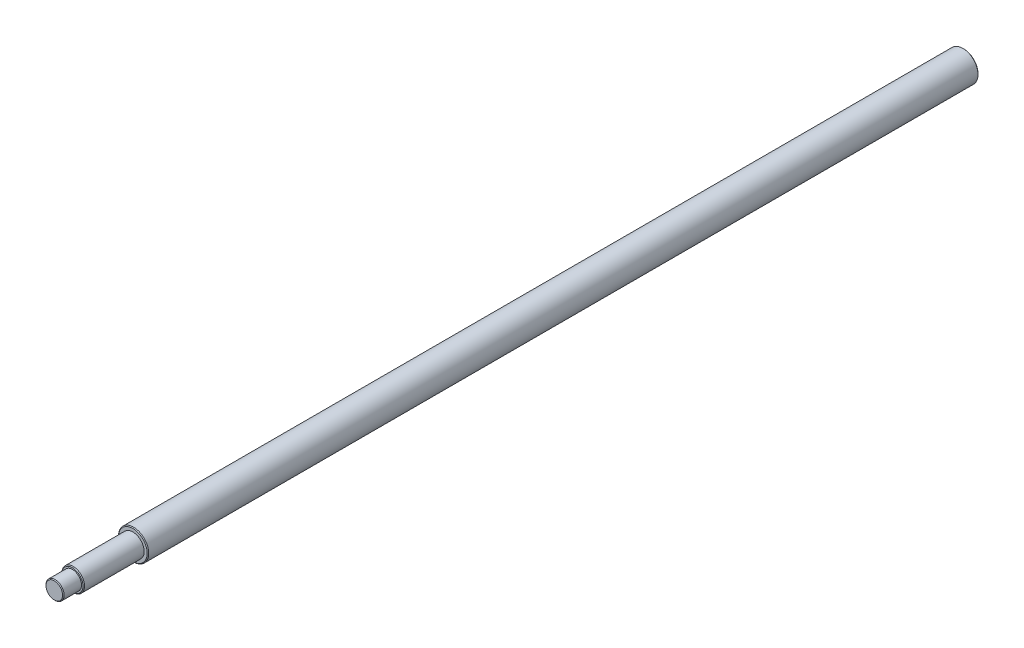
ISO-10303-21;
HEADER;
FILE_DESCRIPTION(('STEP AP214'),'2;1');
FILE_NAME('part.step','',(''),(''),'','','');
FILE_SCHEMA(('AUTOMOTIVE_DESIGN { 1 0 10303 214 1 1 1 1 }'));
ENDSEC;
DATA;
#1=APPLICATION_CONTEXT('core data for automotive mechanical design processes');
#2=APPLICATION_PROTOCOL_DEFINITION('international standard','automotive_design',2000,#1);
#3=PRODUCT_CONTEXT('',#1,'mechanical');
#4=PRODUCT('Part','Part','',(#3));
#5=PRODUCT_RELATED_PRODUCT_CATEGORY('part','',(#4));
#6=PRODUCT_DEFINITION_FORMATION('','',#4);
#7=PRODUCT_DEFINITION_CONTEXT('part definition',#1,'design');
#8=PRODUCT_DEFINITION('design','',#6,#7);
#9=PRODUCT_DEFINITION_SHAPE('','',#8);
#10=(LENGTH_UNIT() NAMED_UNIT(*) SI_UNIT(.MILLI.,.METRE.));
#11=(NAMED_UNIT(*) PLANE_ANGLE_UNIT() SI_UNIT($,.RADIAN.));
#12=(NAMED_UNIT(*) SI_UNIT($,.STERADIAN.) SOLID_ANGLE_UNIT());
#13=UNCERTAINTY_MEASURE_WITH_UNIT(LENGTH_MEASURE(1.E-05),#10,'distance_accuracy_value','');
#14=(GEOMETRIC_REPRESENTATION_CONTEXT(3) GLOBAL_UNCERTAINTY_ASSIGNED_CONTEXT((#13)) GLOBAL_UNIT_ASSIGNED_CONTEXT((#10,
#11,#12)) REPRESENTATION_CONTEXT('',''));
#15=CARTESIAN_POINT('',(0.,0.,0.));
#16=DIRECTION('',(0.,0.,1.));
#17=DIRECTION('',(1.,0.,0.));
#18=AXIS2_PLACEMENT_3D('',#15,#16,#17);
#19=CARTESIAN_POINT('',(0.,0.,590.));
#20=DIRECTION('',(0.,0.,1.));
#21=DIRECTION('',(1.,0.,0.));
#22=AXIS2_PLACEMENT_3D('',#19,#20,#21);
#23=PLANE('',#22);
#24=CARTESIAN_POINT('',(0.,0.,590.));
#25=DIRECTION('',(0.,0.,1.));
#26=DIRECTION('',(1.,0.,0.));
#27=AXIS2_PLACEMENT_3D('',#24,#25,#26);
#28=CIRCLE('',#27,7.00000000000006);
#29=CARTESIAN_POINT('',(7.00000000000006,0.,590.));
#30=VERTEX_POINT('',#29);
#31=EDGE_CURVE('E52',#30,#30,#28,.T.);
#32=ORIENTED_EDGE('',*,*,#31,.T.);
#33=EDGE_LOOP('',(#32));
#34=FACE_BOUND('',#33,.T.);
#35=CARTESIAN_POINT('',(0.,0.,590.));
#36=DIRECTION('',(0.,0.,1.));
#37=DIRECTION('',(1.,0.,0.));
#38=AXIS2_PLACEMENT_3D('',#35,#36,#37);
#39=CIRCLE('',#38,6.);
#40=CARTESIAN_POINT('',(6.,0.,590.));
#41=VERTEX_POINT('',#40);
#42=EDGE_CURVE('E72',#41,#41,#39,.T.);
#43=ORIENTED_EDGE('',*,*,#42,.F.);
#44=EDGE_LOOP('',(#43));
#45=FACE_BOUND('',#44,.T.);
#46=ADVANCED_FACE('F37',(#34,#45),#23,.T.);
#47=CARTESIAN_POINT('',(0.,0.,550.));
#48=DIRECTION('',(0.,0.,1.));
#49=DIRECTION('',(1.,0.,0.));
#50=AXIS2_PLACEMENT_3D('',#47,#48,#49);
#51=PLANE('',#50);
#52=CARTESIAN_POINT('',(0.,0.,550.));
#53=DIRECTION('',(0.,0.,1.));
#54=DIRECTION('',(1.,0.,0.));
#55=AXIS2_PLACEMENT_3D('',#52,#53,#54);
#56=CIRCLE('',#55,9.50000000000006);
#57=CARTESIAN_POINT('',(9.50000000000006,0.,550.));
#58=VERTEX_POINT('',#57);
#59=EDGE_CURVE('E57',#58,#58,#56,.T.);
#60=ORIENTED_EDGE('',*,*,#59,.T.);
#61=EDGE_LOOP('',(#60));
#62=FACE_BOUND('',#61,.T.);
#63=CARTESIAN_POINT('',(0.,0.,550.));
#64=DIRECTION('',(0.,0.,1.));
#65=DIRECTION('',(1.,0.,0.));
#66=AXIS2_PLACEMENT_3D('',#63,#64,#65);
#67=CIRCLE('',#66,7.5);
#68=CARTESIAN_POINT('',(7.5,0.,550.));
#69=VERTEX_POINT('',#68);
#70=EDGE_CURVE('E69',#69,#69,#67,.T.);
#71=ORIENTED_EDGE('',*,*,#70,.F.);
#72=EDGE_LOOP('',(#71));
#73=FACE_BOUND('',#72,.T.);
#74=ADVANCED_FACE('F79',(#62,#73),#51,.T.);
#75=CARTESIAN_POINT('',(0.,0.,550.));
#76=DIRECTION('',(0.,0.,-1.));
#77=DIRECTION('',(-1.,0.,0.));
#78=AXIS2_PLACEMENT_3D('',#75,#76,#77);
#79=CYLINDRICAL_SURFACE('',#78,10.);
#80=CARTESIAN_POINT('',(0.,0.,0.499999999999945));
#81=DIRECTION('',(0.,0.,1.));
#82=DIRECTION('',(1.,0.,0.));
#83=AXIS2_PLACEMENT_3D('',#80,#81,#82);
#84=CIRCLE('',#83,10.);
#85=CARTESIAN_POINT('',(10.,0.,0.499999999999945));
#86=VERTEX_POINT('',#85);
#87=EDGE_CURVE('E63',#86,#86,#84,.T.);
#88=ORIENTED_EDGE('',*,*,#87,.T.);
#89=EDGE_LOOP('',(#88));
#90=FACE_BOUND('',#89,.T.);
#91=CARTESIAN_POINT('',(0.,0.,549.5));
#92=DIRECTION('',(0.,0.,1.));
#93=DIRECTION('',(1.,0.,0.));
#94=AXIS2_PLACEMENT_3D('',#91,#92,#93);
#95=CIRCLE('',#94,10.);
#96=CARTESIAN_POINT('',(10.,0.,549.5));
#97=VERTEX_POINT('',#96);
#98=EDGE_CURVE('E66',#97,#97,#95,.F.);
#99=ORIENTED_EDGE('',*,*,#98,.T.);
#100=EDGE_LOOP('',(#99));
#101=FACE_BOUND('',#100,.T.);
#102=ADVANCED_FACE('F85',(#90,#101),#79,.T.);
#103=CARTESIAN_POINT('',(0.,0.,0.));
#104=DIRECTION('',(0.,0.,1.));
#105=DIRECTION('',(1.,0.,0.));
#106=AXIS2_PLACEMENT_3D('',#103,#104,#105);
#107=PLANE('',#106);
#108=CARTESIAN_POINT('',(0.,0.,0.));
#109=DIRECTION('',(0.,0.,1.));
#110=DIRECTION('',(1.,0.,0.));
#111=AXIS2_PLACEMENT_3D('',#108,#109,#110);
#112=CIRCLE('',#111,9.50000000000006);
#113=CARTESIAN_POINT('',(9.50000000000006,0.,0.));
#114=VERTEX_POINT('',#113);
#115=EDGE_CURVE('E60',#114,#114,#112,.F.);
#116=ORIENTED_EDGE('',*,*,#115,.T.);
#117=EDGE_LOOP('',(#116));
#118=FACE_BOUND('',#117,.T.);
#119=ADVANCED_FACE('F93',(#118),#107,.F.);
#120=CARTESIAN_POINT('',(0.,0.,590.));
#121=DIRECTION('',(0.,0.,-1.));
#122=DIRECTION('',(-1.,0.,0.));
#123=AXIS2_PLACEMENT_3D('',#120,#121,#122);
#124=CYLINDRICAL_SURFACE('',#123,7.5);
#125=CARTESIAN_POINT('',(0.,0.,589.5));
#126=DIRECTION('',(0.,0.,1.));
#127=DIRECTION('',(1.,0.,0.));
#128=AXIS2_PLACEMENT_3D('',#125,#126,#127);
#129=CIRCLE('',#128,7.5);
#130=CARTESIAN_POINT('',(7.5,0.,589.5));
#131=VERTEX_POINT('',#130);
#132=EDGE_CURVE('E48',#131,#131,#129,.F.);
#133=ORIENTED_EDGE('',*,*,#132,.T.);
#134=EDGE_LOOP('',(#133));
#135=FACE_BOUND('',#134,.T.);
#136=ORIENTED_EDGE('',*,*,#70,.T.);
#137=EDGE_LOOP('',(#136));
#138=FACE_BOUND('',#137,.T.);
#139=ADVANCED_FACE('F91',(#135,#138),#124,.T.);
#140=CARTESIAN_POINT('',(0.,0.,602.));
#141=DIRECTION('',(0.,0.,-1.));
#142=DIRECTION('',(-1.,0.,0.));
#143=AXIS2_PLACEMENT_3D('',#140,#141,#142);
#144=CYLINDRICAL_SURFACE('',#143,6.);
#145=CARTESIAN_POINT('',(0.,0.,601.5));
#146=DIRECTION('',(0.,0.,1.));
#147=DIRECTION('',(1.,0.,0.));
#148=AXIS2_PLACEMENT_3D('',#145,#146,#147);
#149=CIRCLE('',#148,6.);
#150=CARTESIAN_POINT('',(6.,0.,601.5));
#151=VERTEX_POINT('',#150);
#152=EDGE_CURVE('E10',#151,#151,#149,.F.);
#153=ORIENTED_EDGE('',*,*,#152,.T.);
#154=EDGE_LOOP('',(#153));
#155=FACE_BOUND('',#154,.T.);
#156=ORIENTED_EDGE('',*,*,#42,.T.);
#157=EDGE_LOOP('',(#156));
#158=FACE_BOUND('',#157,.T.);
#159=ADVANCED_FACE('F76',(#155,#158),#144,.T.);
#160=CARTESIAN_POINT('',(0.,0.,602.));
#161=DIRECTION('',(0.,0.,1.));
#162=DIRECTION('',(1.,0.,0.));
#163=AXIS2_PLACEMENT_3D('',#160,#161,#162);
#164=PLANE('',#163);
#165=CARTESIAN_POINT('',(0.,0.,602.));
#166=DIRECTION('',(0.,0.,1.));
#167=DIRECTION('',(1.,0.,0.));
#168=AXIS2_PLACEMENT_3D('',#165,#166,#167);
#169=CIRCLE('',#168,5.50000000000001);
#170=CARTESIAN_POINT('',(5.50000000000001,0.,602.));
#171=VERTEX_POINT('',#170);
#172=EDGE_CURVE('E44',#171,#171,#169,.T.);
#173=ORIENTED_EDGE('',*,*,#172,.T.);
#174=EDGE_LOOP('',(#173));
#175=FACE_BOUND('',#174,.T.);
#176=ADVANCED_FACE('F106',(#175),#164,.T.);
#177=CARTESIAN_POINT('',(0.,0.,0.499999999999945));
#178=DIRECTION('',(0.,0.,1.));
#179=DIRECTION('',(1.,0.,0.));
#180=AXIS2_PLACEMENT_3D('',#177,#178,#179);
#181=CONICAL_SURFACE('',#180,10.,0.78539816339744);
#182=ORIENTED_EDGE('',*,*,#115,.F.);
#183=EDGE_LOOP('',(#182));
#184=FACE_BOUND('',#183,.T.);
#185=ORIENTED_EDGE('',*,*,#87,.F.);
#186=EDGE_LOOP('',(#185));
#187=FACE_BOUND('',#186,.T.);
#188=ADVANCED_FACE('F102',(#184,#187),#181,.T.);
#189=CARTESIAN_POINT('',(0.,0.,550.));
#190=DIRECTION('',(0.,0.,-1.));
#191=DIRECTION('',(-1.,0.,0.));
#192=AXIS2_PLACEMENT_3D('',#189,#190,#191);
#193=CONICAL_SURFACE('',#192,9.50000000000006,0.78539816339744);
#194=ORIENTED_EDGE('',*,*,#98,.F.);
#195=EDGE_LOOP('',(#194));
#196=FACE_BOUND('',#195,.T.);
#197=ORIENTED_EDGE('',*,*,#59,.F.);
#198=EDGE_LOOP('',(#197));
#199=FACE_BOUND('',#198,.T.);
#200=ADVANCED_FACE('F105',(#196,#199),#193,.T.);
#201=CARTESIAN_POINT('',(0.,0.,590.));
#202=DIRECTION('',(0.,0.,-1.));
#203=DIRECTION('',(-1.,0.,0.));
#204=AXIS2_PLACEMENT_3D('',#201,#202,#203);
#205=CONICAL_SURFACE('',#204,7.00000000000006,0.785398163397442);
#206=ORIENTED_EDGE('',*,*,#132,.F.);
#207=EDGE_LOOP('',(#206));
#208=FACE_BOUND('',#207,.T.);
#209=ORIENTED_EDGE('',*,*,#31,.F.);
#210=EDGE_LOOP('',(#209));
#211=FACE_BOUND('',#210,.T.);
#212=ADVANCED_FACE('F109',(#208,#211),#205,.T.);
#213=CARTESIAN_POINT('',(0.,0.,602.));
#214=DIRECTION('',(0.,0.,-1.));
#215=DIRECTION('',(-1.,0.,0.));
#216=AXIS2_PLACEMENT_3D('',#213,#214,#215);
#217=CONICAL_SURFACE('',#216,5.50000000000001,0.785398163397499);
#218=ORIENTED_EDGE('',*,*,#152,.F.);
#219=EDGE_LOOP('',(#218));
#220=FACE_BOUND('',#219,.T.);
#221=ORIENTED_EDGE('',*,*,#172,.F.);
#222=EDGE_LOOP('',(#221));
#223=FACE_BOUND('',#222,.T.);
#224=ADVANCED_FACE('F39',(#220,#223),#217,.T.);
#225=CLOSED_SHELL('',(#46,#74,#102,#119,#139,#159,#176,#188,#200,#212,#224));
#226=MANIFOLD_SOLID_BREP('B2',#225);
#227=ADVANCED_BREP_SHAPE_REPRESENTATION('',(#18,#226),#14);
#228=SHAPE_DEFINITION_REPRESENTATION(#9,#227);
ENDSEC;
END-ISO-10303-21;
